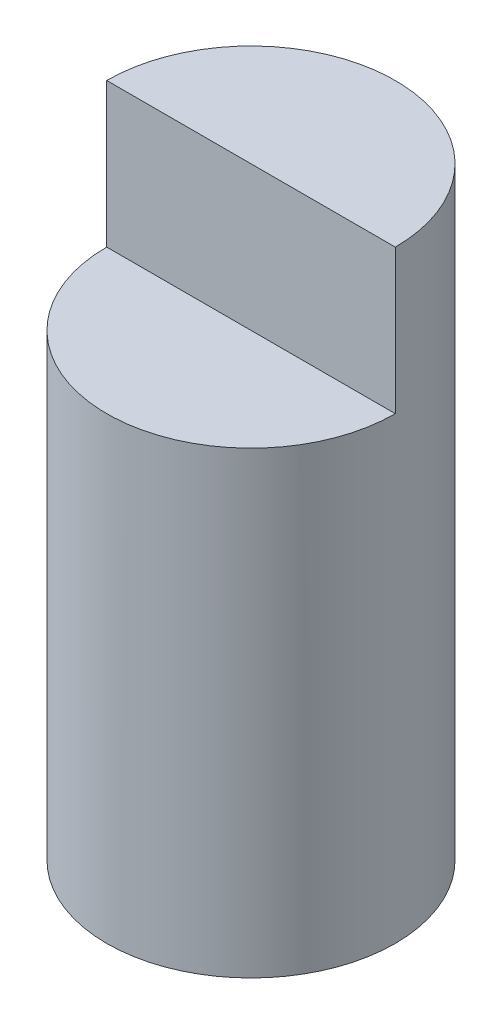
ISO-10303-21;
HEADER;
FILE_DESCRIPTION(('STEP AP214'),'2;1');
FILE_NAME('part.step','',(''),(''),'','','');
FILE_SCHEMA(('AUTOMOTIVE_DESIGN { 1 0 10303 214 1 1 1 1 }'));
ENDSEC;
DATA;
#1=APPLICATION_CONTEXT('core data for automotive mechanical design processes');
#2=APPLICATION_PROTOCOL_DEFINITION('international standard','automotive_design',2000,#1);
#3=PRODUCT_CONTEXT('',#1,'mechanical');
#4=PRODUCT('Part','Part','',(#3));
#5=PRODUCT_RELATED_PRODUCT_CATEGORY('part','',(#4));
#6=PRODUCT_DEFINITION_FORMATION('','',#4);
#7=PRODUCT_DEFINITION_CONTEXT('part definition',#1,'design');
#8=PRODUCT_DEFINITION('design','',#6,#7);
#9=PRODUCT_DEFINITION_SHAPE('','',#8);
#10=(LENGTH_UNIT() NAMED_UNIT(*) SI_UNIT(.MILLI.,.METRE.));
#11=(NAMED_UNIT(*) PLANE_ANGLE_UNIT() SI_UNIT($,.RADIAN.));
#12=(NAMED_UNIT(*) SI_UNIT($,.STERADIAN.) SOLID_ANGLE_UNIT());
#13=UNCERTAINTY_MEASURE_WITH_UNIT(LENGTH_MEASURE(1.E-05),#10,'distance_accuracy_value','');
#14=(GEOMETRIC_REPRESENTATION_CONTEXT(3) GLOBAL_UNCERTAINTY_ASSIGNED_CONTEXT((#13)) GLOBAL_UNIT_ASSIGNED_CONTEXT((#10,
#11,#12)) REPRESENTATION_CONTEXT('',''));
#15=CARTESIAN_POINT('',(0.,0.,0.));
#16=DIRECTION('',(0.,0.,1.));
#17=DIRECTION('',(1.,0.,0.));
#18=AXIS2_PLACEMENT_3D('',#15,#16,#17);
#19=CARTESIAN_POINT('',(25.0404328042381,0.,-11.3573031501599));
#20=DIRECTION('',(0.,1.,0.));
#21=DIRECTION('',(0.,0.,1.));
#22=AXIS2_PLACEMENT_3D('',#19,#20,#21);
#23=PLANE('',#22);
#24=CARTESIAN_POINT('',(25.0404328042381,0.,-11.3573031501599));
#25=DIRECTION('',(0.,-1.,0.));
#26=DIRECTION('',(0.,0.,-1.));
#27=AXIS2_PLACEMENT_3D('',#24,#25,#26);
#28=CIRCLE('',#27,1.27);
#29=CARTESIAN_POINT('',(25.0404328042381,0.,-12.6273031501599));
#30=VERTEX_POINT('',#29);
#31=EDGE_CURVE('E86',#30,#30,#28,.T.);
#32=ORIENTED_EDGE('',*,*,#31,.F.);
#33=EDGE_LOOP('',(#32));
#34=FACE_BOUND('',#33,.T.);
#35=CARTESIAN_POINT('',(25.0404328042381,0.,-11.3573031501599));
#36=DIRECTION('',(0.,1.,0.));
#37=DIRECTION('',(0.,0.,1.));
#38=AXIS2_PLACEMENT_3D('',#35,#36,#37);
#39=CIRCLE('',#38,3.175);
#40=CARTESIAN_POINT('',(25.0404328042381,0.,-8.18230315015987));
#41=VERTEX_POINT('',#40);
#42=EDGE_CURVE('E76',#41,#41,#39,.T.);
#43=ORIENTED_EDGE('',*,*,#42,.F.);
#44=EDGE_LOOP('',(#43));
#45=FACE_BOUND('',#44,.T.);
#46=ADVANCED_FACE('F40',(#34,#45),#23,.F.);
#47=CARTESIAN_POINT('',(25.0404328042381,22.5057561210692,-11.3573031501599));
#48=DIRECTION('',(0.,-1.,0.));
#49=DIRECTION('',(0.,0.,-1.));
#50=AXIS2_PLACEMENT_3D('',#47,#48,#49);
#51=CYLINDRICAL_SURFACE('',#50,3.175);
#52=CARTESIAN_POINT('',(25.0404328042381,13.2715,-11.3573031501599));
#53=DIRECTION('',(0.,-1.,0.));
#54=DIRECTION('',(0.,0.,-1.));
#55=AXIS2_PLACEMENT_3D('',#52,#53,#54);
#56=CIRCLE('',#55,3.175);
#57=CARTESIAN_POINT('',(21.8654328042381,13.2715,-11.3573031501599));
#58=VERTEX_POINT('',#57);
#59=CARTESIAN_POINT('',(28.2154328042381,13.2715,-11.3573031501599));
#60=VERTEX_POINT('',#59);
#61=EDGE_CURVE('E48',#58,#60,#56,.T.);
#62=ORIENTED_EDGE('',*,*,#61,.T.);
#63=DIRECTION('',(0.,1.,0.));
#64=VECTOR('',#63,1.);
#65=CARTESIAN_POINT('',(28.2154328042381,10.0965,-11.3573031501599));
#66=LINE('',#65,#64);
#67=CARTESIAN_POINT('',(28.2154328042381,10.0965,-11.3573031501599));
#68=VERTEX_POINT('',#67);
#69=EDGE_CURVE('E55',#68,#60,#66,.T.);
#70=ORIENTED_EDGE('',*,*,#69,.F.);
#71=CARTESIAN_POINT('',(25.0404328042381,10.0965,-11.3573031501599));
#72=DIRECTION('',(0.,1.,0.));
#73=DIRECTION('',(0.,0.,1.));
#74=AXIS2_PLACEMENT_3D('',#71,#72,#73);
#75=CIRCLE('',#74,3.175);
#76=CARTESIAN_POINT('',(21.8654328042381,10.0965,-11.3573031501599));
#77=VERTEX_POINT('',#76);
#78=EDGE_CURVE('E13',#77,#68,#75,.T.);
#79=ORIENTED_EDGE('',*,*,#78,.F.);
#80=DIRECTION('',(0.,1.,0.));
#81=VECTOR('',#80,1.);
#82=CARTESIAN_POINT('',(21.8654328042381,10.0965,-11.3573031501599));
#83=LINE('',#82,#81);
#84=EDGE_CURVE('E61',#77,#58,#83,.T.);
#85=ORIENTED_EDGE('',*,*,#84,.T.);
#86=EDGE_LOOP('',(#62,#70,#79,#85));
#87=FACE_BOUND('',#86,.T.);
#88=ORIENTED_EDGE('',*,*,#42,.T.);
#89=EDGE_LOOP('',(#88));
#90=FACE_BOUND('',#89,.T.);
#91=ADVANCED_FACE('F42',(#87,#90),#51,.T.);
#92=CARTESIAN_POINT('',(70.7604328042381,13.2715,-28.5741400595482));
#93=DIRECTION('',(0.,-1.,0.));
#94=DIRECTION('',(0.,0.,1.));
#95=AXIS2_PLACEMENT_3D('',#92,#93,#94);
#96=PLANE('',#95);
#97=ORIENTED_EDGE('',*,*,#61,.F.);
#98=DIRECTION('',(-1.,0.,0.));
#99=VECTOR('',#98,1.);
#100=CARTESIAN_POINT('',(28.2154328042381,13.2715,-11.3573031501599));
#101=LINE('',#100,#99);
#102=EDGE_CURVE('E65',#60,#58,#101,.T.);
#103=ORIENTED_EDGE('',*,*,#102,.F.);
#104=EDGE_LOOP('',(#97,#103));
#105=FACE_BOUND('',#104,.T.);
#106=ADVANCED_FACE('F78',(#105),#96,.F.);
#107=CARTESIAN_POINT('',(0.,10.0965,0.));
#108=DIRECTION('',(0.,1.,0.));
#109=DIRECTION('',(0.,0.,1.));
#110=AXIS2_PLACEMENT_3D('',#107,#108,#109);
#111=PLANE('',#110);
#112=ORIENTED_EDGE('',*,*,#78,.T.);
#113=DIRECTION('',(-1.,0.,0.));
#114=VECTOR('',#113,1.);
#115=CARTESIAN_POINT('',(28.2154328042381,10.0965,-11.3573031501599));
#116=LINE('',#115,#114);
#117=EDGE_CURVE('E70',#68,#77,#116,.T.);
#118=ORIENTED_EDGE('',*,*,#117,.T.);
#119=EDGE_LOOP('',(#112,#118));
#120=FACE_BOUND('',#119,.T.);
#121=ADVANCED_FACE('F100',(#120),#111,.T.);
#122=CARTESIAN_POINT('',(28.2154328042381,10.0965,-11.3573031501599));
#123=DIRECTION('',(0.,0.,-1.));
#124=DIRECTION('',(0.,1.,0.));
#125=AXIS2_PLACEMENT_3D('',#122,#123,#124);
#126=PLANE('',#125);
#127=ORIENTED_EDGE('',*,*,#102,.T.);
#128=ORIENTED_EDGE('',*,*,#84,.F.);
#129=ORIENTED_EDGE('',*,*,#117,.F.);
#130=ORIENTED_EDGE('',*,*,#69,.T.);
#131=EDGE_LOOP('',(#127,#128,#129,#130));
#132=FACE_BOUND('',#131,.T.);
#133=ADVANCED_FACE('F66',(#132),#126,.F.);
#134=CARTESIAN_POINT('',(0.,8.50900000000004,0.));
#135=DIRECTION('',(0.,1.,0.));
#136=DIRECTION('',(0.,0.,1.));
#137=AXIS2_PLACEMENT_3D('',#134,#135,#136);
#138=PLANE('',#137);
#139=CARTESIAN_POINT('',(25.0404328042381,8.50900000000003,-11.3573031501599));
#140=DIRECTION('',(0.,1.,0.));
#141=DIRECTION('',(0.,0.,1.));
#142=AXIS2_PLACEMENT_3D('',#139,#140,#141);
#143=CIRCLE('',#142,1.27);
#144=CARTESIAN_POINT('',(25.0404328042381,8.50900000000003,-10.0873031501599));
#145=VERTEX_POINT('',#144);
#146=EDGE_CURVE('E71',#145,#145,#143,.F.);
#147=ORIENTED_EDGE('',*,*,#146,.T.);
#148=EDGE_LOOP('',(#147));
#149=FACE_BOUND('',#148,.T.);
#150=ADVANCED_FACE('F109',(#149),#138,.F.);
#151=CARTESIAN_POINT('',(25.0404328042381,13.6886024484277,-11.3573031501599));
#152=DIRECTION('',(0.,-1.,0.));
#153=DIRECTION('',(0.,0.,-1.));
#154=AXIS2_PLACEMENT_3D('',#151,#152,#153);
#155=CYLINDRICAL_SURFACE('',#154,1.27);
#156=ORIENTED_EDGE('',*,*,#31,.T.);
#157=EDGE_LOOP('',(#156));
#158=FACE_BOUND('',#157,.T.);
#159=ORIENTED_EDGE('',*,*,#146,.F.);
#160=EDGE_LOOP('',(#159));
#161=FACE_BOUND('',#160,.T.);
#162=ADVANCED_FACE('F90',(#158,#161),#155,.F.);
#163=CLOSED_SHELL('',(#46,#91,#106,#121,#133,#150,#162));
#164=MANIFOLD_SOLID_BREP('B2',#163);
#165=ADVANCED_BREP_SHAPE_REPRESENTATION('',(#18,#164),#14);
#166=SHAPE_DEFINITION_REPRESENTATION(#9,#165);
ENDSEC;
END-ISO-10303-21;
